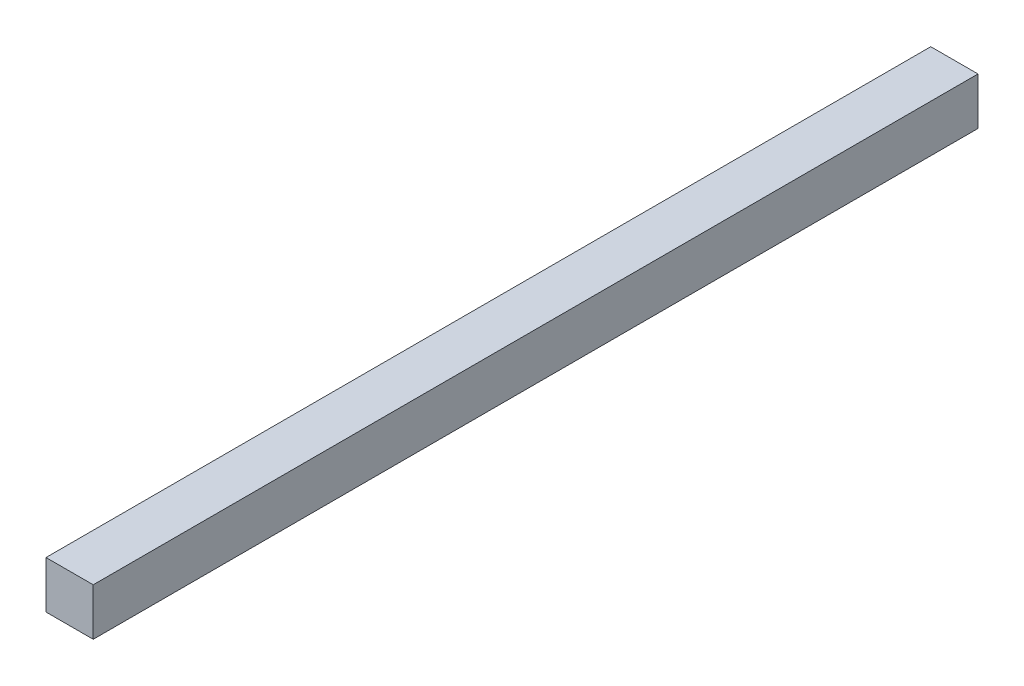
ISO-10303-21;
HEADER;
FILE_DESCRIPTION(('STEP AP214'),'2;1');
FILE_NAME('part.step','',(''),(''),'','','');
FILE_SCHEMA(('AUTOMOTIVE_DESIGN { 1 0 10303 214 1 1 1 1 }'));
ENDSEC;
DATA;
#1=APPLICATION_CONTEXT('core data for automotive mechanical design processes');
#2=APPLICATION_PROTOCOL_DEFINITION('international standard','automotive_design',2000,#1);
#3=PRODUCT_CONTEXT('',#1,'mechanical');
#4=PRODUCT('Part','Part','',(#3));
#5=PRODUCT_RELATED_PRODUCT_CATEGORY('part','',(#4));
#6=PRODUCT_DEFINITION_FORMATION('','',#4);
#7=PRODUCT_DEFINITION_CONTEXT('part definition',#1,'design');
#8=PRODUCT_DEFINITION('design','',#6,#7);
#9=PRODUCT_DEFINITION_SHAPE('','',#8);
#10=(LENGTH_UNIT() NAMED_UNIT(*) SI_UNIT(.MILLI.,.METRE.));
#11=(NAMED_UNIT(*) PLANE_ANGLE_UNIT() SI_UNIT($,.RADIAN.));
#12=(NAMED_UNIT(*) SI_UNIT($,.STERADIAN.) SOLID_ANGLE_UNIT());
#13=UNCERTAINTY_MEASURE_WITH_UNIT(LENGTH_MEASURE(1.E-05),#10,'distance_accuracy_value','');
#14=(GEOMETRIC_REPRESENTATION_CONTEXT(3) GLOBAL_UNCERTAINTY_ASSIGNED_CONTEXT((#13)) GLOBAL_UNIT_ASSIGNED_CONTEXT((#10,
#11,#12)) REPRESENTATION_CONTEXT('',''));
#15=CARTESIAN_POINT('',(0.,0.,0.));
#16=DIRECTION('',(0.,0.,1.));
#17=DIRECTION('',(1.,0.,0.));
#18=AXIS2_PLACEMENT_3D('',#15,#16,#17);
#19=CARTESIAN_POINT('',(15.,15.,281.));
#20=DIRECTION('',(-1.,0.,0.));
#21=DIRECTION('',(0.,0.,1.));
#22=AXIS2_PLACEMENT_3D('',#19,#20,#21);
#23=PLANE('',#22);
#24=DIRECTION('',(0.,1.,0.));
#25=VECTOR('',#24,1.);
#26=CARTESIAN_POINT('',(15.,15.,-281.));
#27=LINE('',#26,#25);
#28=CARTESIAN_POINT('',(15.,-15.,-281.));
#29=VERTEX_POINT('',#28);
#30=CARTESIAN_POINT('',(15.,15.,-281.));
#31=VERTEX_POINT('',#30);
#32=EDGE_CURVE('E107',#29,#31,#27,.T.);
#33=ORIENTED_EDGE('',*,*,#32,.T.);
#34=DIRECTION('',(0.,0.,-1.));
#35=VECTOR('',#34,1.);
#36=CARTESIAN_POINT('',(15.,15.,281.));
#37=LINE('',#36,#35);
#38=CARTESIAN_POINT('',(15.,15.,281.));
#39=VERTEX_POINT('',#38);
#40=EDGE_CURVE('E11',#39,#31,#37,.T.);
#41=ORIENTED_EDGE('',*,*,#40,.F.);
#42=DIRECTION('',(0.,1.,0.));
#43=VECTOR('',#42,1.);
#44=CARTESIAN_POINT('',(15.,15.,281.));
#45=LINE('',#44,#43);
#46=CARTESIAN_POINT('',(15.,-15.,281.));
#47=VERTEX_POINT('',#46);
#48=EDGE_CURVE('E91',#47,#39,#45,.T.);
#49=ORIENTED_EDGE('',*,*,#48,.F.);
#50=DIRECTION('',(0.,0.,-1.));
#51=VECTOR('',#50,1.);
#52=CARTESIAN_POINT('',(15.,-15.,281.));
#53=LINE('',#52,#51);
#54=EDGE_CURVE('E103',#47,#29,#53,.T.);
#55=ORIENTED_EDGE('',*,*,#54,.T.);
#56=EDGE_LOOP('',(#33,#41,#49,#55));
#57=FACE_BOUND('',#56,.T.);
#58=ADVANCED_FACE('F39',(#57),#23,.F.);
#59=CARTESIAN_POINT('',(-15.,15.,281.));
#60=DIRECTION('',(0.,-1.,0.));
#61=DIRECTION('',(0.,0.,-1.));
#62=AXIS2_PLACEMENT_3D('',#59,#60,#61);
#63=PLANE('',#62);
#64=DIRECTION('',(-1.,0.,0.));
#65=VECTOR('',#64,1.);
#66=CARTESIAN_POINT('',(-15.,15.,-281.));
#67=LINE('',#66,#65);
#68=CARTESIAN_POINT('',(-15.,15.,-281.));
#69=VERTEX_POINT('',#68);
#70=EDGE_CURVE('E96',#31,#69,#67,.T.);
#71=ORIENTED_EDGE('',*,*,#70,.T.);
#72=DIRECTION('',(0.,0.,-1.));
#73=VECTOR('',#72,1.);
#74=CARTESIAN_POINT('',(-15.,15.,281.));
#75=LINE('',#74,#73);
#76=CARTESIAN_POINT('',(-15.,15.,281.));
#77=VERTEX_POINT('',#76);
#78=EDGE_CURVE('E48',#77,#69,#75,.T.);
#79=ORIENTED_EDGE('',*,*,#78,.F.);
#80=DIRECTION('',(-1.,0.,0.));
#81=VECTOR('',#80,1.);
#82=CARTESIAN_POINT('',(-15.,15.,281.));
#83=LINE('',#82,#81);
#84=EDGE_CURVE('E86',#39,#77,#83,.T.);
#85=ORIENTED_EDGE('',*,*,#84,.F.);
#86=ORIENTED_EDGE('',*,*,#40,.T.);
#87=EDGE_LOOP('',(#71,#79,#85,#86));
#88=FACE_BOUND('',#87,.T.);
#89=ADVANCED_FACE('F95',(#88),#63,.F.);
#90=CARTESIAN_POINT('',(-15.,15.,281.));
#91=DIRECTION('',(1.,0.,0.));
#92=DIRECTION('',(0.,0.,-1.));
#93=AXIS2_PLACEMENT_3D('',#90,#91,#92);
#94=PLANE('',#93);
#95=DIRECTION('',(0.,-1.,0.));
#96=VECTOR('',#95,1.);
#97=CARTESIAN_POINT('',(-15.,15.,-281.));
#98=LINE('',#97,#96);
#99=CARTESIAN_POINT('',(-15.,-15.,-281.));
#100=VERTEX_POINT('',#99);
#101=EDGE_CURVE('E73',#69,#100,#98,.T.);
#102=ORIENTED_EDGE('',*,*,#101,.T.);
#103=DIRECTION('',(0.,0.,-1.));
#104=VECTOR('',#103,1.);
#105=CARTESIAN_POINT('',(-15.,-15.,281.));
#106=LINE('',#105,#104);
#107=CARTESIAN_POINT('',(-15.,-15.,281.));
#108=VERTEX_POINT('',#107);
#109=EDGE_CURVE('E98',#108,#100,#106,.T.);
#110=ORIENTED_EDGE('',*,*,#109,.F.);
#111=DIRECTION('',(0.,-1.,0.));
#112=VECTOR('',#111,1.);
#113=CARTESIAN_POINT('',(-15.,15.,281.));
#114=LINE('',#113,#112);
#115=EDGE_CURVE('E89',#77,#108,#114,.T.);
#116=ORIENTED_EDGE('',*,*,#115,.F.);
#117=ORIENTED_EDGE('',*,*,#78,.T.);
#118=EDGE_LOOP('',(#102,#110,#116,#117));
#119=FACE_BOUND('',#118,.T.);
#120=ADVANCED_FACE('F99',(#119),#94,.F.);
#121=CARTESIAN_POINT('',(-15.,-15.,281.));
#122=DIRECTION('',(0.,1.,0.));
#123=DIRECTION('',(0.,0.,1.));
#124=AXIS2_PLACEMENT_3D('',#121,#122,#123);
#125=PLANE('',#124);
#126=DIRECTION('',(1.,0.,0.));
#127=VECTOR('',#126,1.);
#128=CARTESIAN_POINT('',(-15.,-15.,-281.));
#129=LINE('',#128,#127);
#130=EDGE_CURVE('E79',#100,#29,#129,.T.);
#131=ORIENTED_EDGE('',*,*,#130,.T.);
#132=ORIENTED_EDGE('',*,*,#54,.F.);
#133=DIRECTION('',(1.,0.,0.));
#134=VECTOR('',#133,1.);
#135=CARTESIAN_POINT('',(-15.,-15.,281.));
#136=LINE('',#135,#134);
#137=EDGE_CURVE('E56',#108,#47,#136,.T.);
#138=ORIENTED_EDGE('',*,*,#137,.F.);
#139=ORIENTED_EDGE('',*,*,#109,.T.);
#140=EDGE_LOOP('',(#131,#132,#138,#139));
#141=FACE_BOUND('',#140,.T.);
#142=ADVANCED_FACE('F120',(#141),#125,.F.);
#143=CARTESIAN_POINT('',(0.,0.,281.));
#144=DIRECTION('',(0.,0.,1.));
#145=DIRECTION('',(1.,0.,0.));
#146=AXIS2_PLACEMENT_3D('',#143,#144,#145);
#147=PLANE('',#146);
#148=ORIENTED_EDGE('',*,*,#48,.T.);
#149=ORIENTED_EDGE('',*,*,#84,.T.);
#150=ORIENTED_EDGE('',*,*,#115,.T.);
#151=ORIENTED_EDGE('',*,*,#137,.T.);
#152=EDGE_LOOP('',(#148,#149,#150,#151));
#153=FACE_BOUND('',#152,.T.);
#154=ADVANCED_FACE('F87',(#153),#147,.T.);
#155=CARTESIAN_POINT('',(0.,0.,-281.));
#156=DIRECTION('',(0.,0.,1.));
#157=DIRECTION('',(1.,0.,0.));
#158=AXIS2_PLACEMENT_3D('',#155,#156,#157);
#159=PLANE('',#158);
#160=ORIENTED_EDGE('',*,*,#32,.F.);
#161=ORIENTED_EDGE('',*,*,#130,.F.);
#162=ORIENTED_EDGE('',*,*,#101,.F.);
#163=ORIENTED_EDGE('',*,*,#70,.F.);
#164=EDGE_LOOP('',(#160,#161,#162,#163));
#165=FACE_BOUND('',#164,.T.);
#166=ADVANCED_FACE('F123',(#165),#159,.F.);
#167=CLOSED_SHELL('',(#58,#89,#120,#142,#154,#166));
#168=MANIFOLD_SOLID_BREP('B2',#167);
#169=ADVANCED_BREP_SHAPE_REPRESENTATION('',(#18,#168),#14);
#170=SHAPE_DEFINITION_REPRESENTATION(#9,#169);
ENDSEC;
END-ISO-10303-21;
